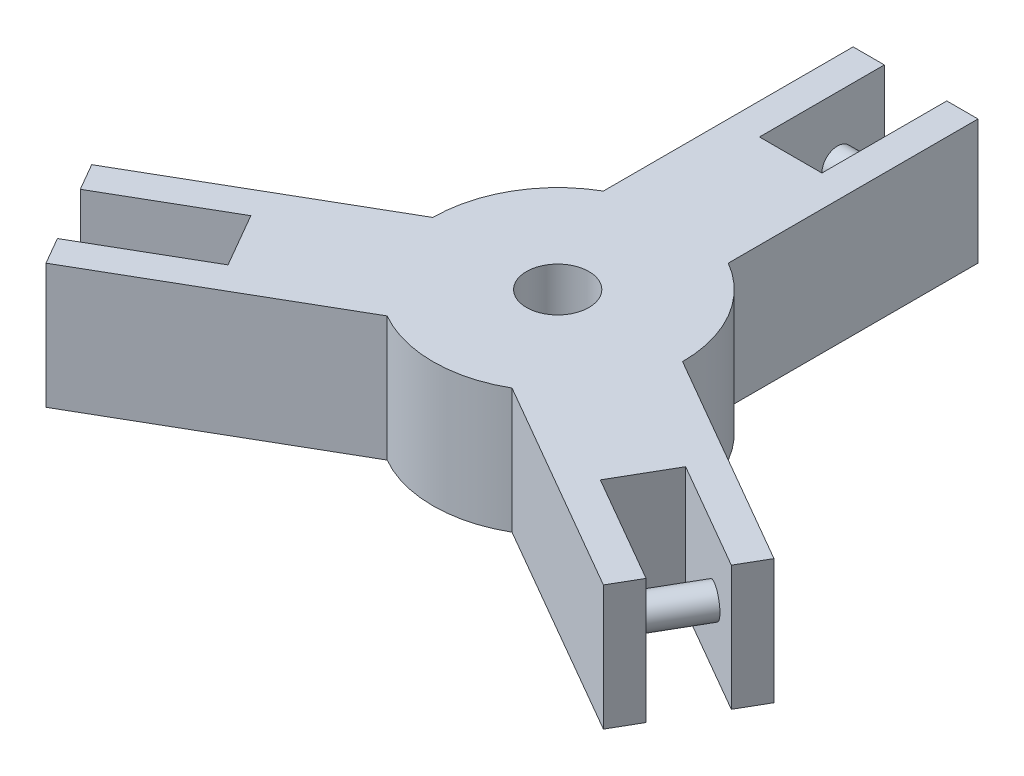
ISO-10303-21;
HEADER;
FILE_DESCRIPTION(('STEP AP214'),'2;1');
FILE_NAME('part.step','',(''),(''),'','','');
FILE_SCHEMA(('AUTOMOTIVE_DESIGN { 1 0 10303 214 1 1 1 1 }'));
ENDSEC;
DATA;
#1=APPLICATION_CONTEXT('core data for automotive mechanical design processes');
#2=APPLICATION_PROTOCOL_DEFINITION('international standard','automotive_design',2000,#1);
#3=PRODUCT_CONTEXT('',#1,'mechanical');
#4=PRODUCT('Part','Part','',(#3));
#5=PRODUCT_RELATED_PRODUCT_CATEGORY('part','',(#4));
#6=PRODUCT_DEFINITION_FORMATION('','',#4);
#7=PRODUCT_DEFINITION_CONTEXT('part definition',#1,'design');
#8=PRODUCT_DEFINITION('design','',#6,#7);
#9=PRODUCT_DEFINITION_SHAPE('','',#8);
#10=(LENGTH_UNIT() NAMED_UNIT(*) SI_UNIT(.MILLI.,.METRE.));
#11=(NAMED_UNIT(*) PLANE_ANGLE_UNIT() SI_UNIT($,.RADIAN.));
#12=(NAMED_UNIT(*) SI_UNIT($,.STERADIAN.) SOLID_ANGLE_UNIT());
#13=UNCERTAINTY_MEASURE_WITH_UNIT(LENGTH_MEASURE(1.E-05),#10,'distance_accuracy_value','');
#14=(GEOMETRIC_REPRESENTATION_CONTEXT(3) GLOBAL_UNCERTAINTY_ASSIGNED_CONTEXT((#13)) GLOBAL_UNIT_ASSIGNED_CONTEXT((#10,
#11,#12)) REPRESENTATION_CONTEXT('',''));
#15=CARTESIAN_POINT('',(0.,0.,0.));
#16=DIRECTION('',(0.,0.,1.));
#17=DIRECTION('',(1.,0.,0.));
#18=AXIS2_PLACEMENT_3D('',#15,#16,#17);
#19=CARTESIAN_POINT('',(10.,40.,0.));
#20=DIRECTION('',(1.,0.,0.));
#21=DIRECTION('',(0.,0.,-1.));
#22=AXIS2_PLACEMENT_3D('',#19,#20,#21);
#23=PLANE('',#22);
#24=DIRECTION('',(0.,0.,1.));
#25=VECTOR('',#24,1.);
#26=CARTESIAN_POINT('',(10.,0.,0.));
#27=LINE('',#26,#25);
#28=CARTESIAN_POINT('',(10.,0.,-114.641016151378));
#29=VERTEX_POINT('',#28);
#30=CARTESIAN_POINT('',(10.,0.,-74.6410161513775));
#31=VERTEX_POINT('',#30);
#32=EDGE_CURVE('E273',#29,#31,#27,.T.);
#33=ORIENTED_EDGE('',*,*,#32,.T.);
#34=DIRECTION('',(0.,-1.,0.));
#35=VECTOR('',#34,1.);
#36=CARTESIAN_POINT('',(10.,40.,-74.6410161513775));
#37=LINE('',#36,#35);
#38=CARTESIAN_POINT('',(10.,40.,-74.6410161513775));
#39=VERTEX_POINT('',#38);
#40=EDGE_CURVE('E322',#39,#31,#37,.T.);
#41=ORIENTED_EDGE('',*,*,#40,.F.);
#42=DIRECTION('',(0.,0.,1.));
#43=VECTOR('',#42,1.);
#44=CARTESIAN_POINT('',(10.,40.,0.));
#45=LINE('',#44,#43);
#46=CARTESIAN_POINT('',(10.,40.,-114.641016151378));
#47=VERTEX_POINT('',#46);
#48=EDGE_CURVE('E387',#47,#39,#45,.T.);
#49=ORIENTED_EDGE('',*,*,#48,.F.);
#50=DIRECTION('',(0.,-1.,0.));
#51=VECTOR('',#50,1.);
#52=CARTESIAN_POINT('',(10.,40.,-114.641016151378));
#53=LINE('',#52,#51);
#54=EDGE_CURVE('E325',#47,#29,#53,.T.);
#55=ORIENTED_EDGE('',*,*,#54,.T.);
#56=EDGE_LOOP('',(#33,#41,#49,#55));
#57=FACE_BOUND('',#56,.T.);
#58=CARTESIAN_POINT('',(10.,20.,-99.6410161513775));
#59=DIRECTION('',(1.,0.,0.));
#60=DIRECTION('',(0.,0.,-1.));
#61=AXIS2_PLACEMENT_3D('',#58,#59,#60);
#62=CIRCLE('',#61,5.);
#63=CARTESIAN_POINT('',(10.,20.,-104.641016151378));
#64=VERTEX_POINT('',#63);
#65=EDGE_CURVE('E350',#64,#64,#62,.F.);
#66=ORIENTED_EDGE('',*,*,#65,.F.);
#67=EDGE_LOOP('',(#66));
#68=FACE_BOUND('',#67,.T.);
#69=ADVANCED_FACE('F38',(#57,#68),#23,.F.);
#70=CARTESIAN_POINT('',(-9.99999999999999,40.,0.));
#71=DIRECTION('',(1.,0.,0.));
#72=DIRECTION('',(0.,0.,-1.));
#73=AXIS2_PLACEMENT_3D('',#70,#71,#72);
#74=PLANE('',#73);
#75=DIRECTION('',(0.,0.,1.));
#76=VECTOR('',#75,1.);
#77=CARTESIAN_POINT('',(-9.99999999999999,0.,0.));
#78=LINE('',#77,#76);
#79=CARTESIAN_POINT('',(-10.,0.,-114.641016151378));
#80=VERTEX_POINT('',#79);
#81=CARTESIAN_POINT('',(-10.,0.,-74.6410161513775));
#82=VERTEX_POINT('',#81);
#83=EDGE_CURVE('E278',#80,#82,#78,.T.);
#84=ORIENTED_EDGE('',*,*,#83,.F.);
#85=DIRECTION('',(0.,-1.,0.));
#86=VECTOR('',#85,1.);
#87=CARTESIAN_POINT('',(-10.,40.,-114.641016151378));
#88=LINE('',#87,#86);
#89=CARTESIAN_POINT('',(-10.,40.,-114.641016151378));
#90=VERTEX_POINT('',#89);
#91=EDGE_CURVE('E318',#90,#80,#88,.T.);
#92=ORIENTED_EDGE('',*,*,#91,.F.);
#93=DIRECTION('',(0.,0.,1.));
#94=VECTOR('',#93,1.);
#95=CARTESIAN_POINT('',(-9.99999999999999,40.,0.));
#96=LINE('',#95,#94);
#97=CARTESIAN_POINT('',(-10.,40.,-74.6410161513775));
#98=VERTEX_POINT('',#97);
#99=EDGE_CURVE('E391',#90,#98,#96,.T.);
#100=ORIENTED_EDGE('',*,*,#99,.T.);
#101=DIRECTION('',(0.,-1.,0.));
#102=VECTOR('',#101,1.);
#103=CARTESIAN_POINT('',(-10.,40.,-74.6410161513775));
#104=LINE('',#103,#102);
#105=EDGE_CURVE('E320',#98,#82,#104,.T.);
#106=ORIENTED_EDGE('',*,*,#105,.T.);
#107=EDGE_LOOP('',(#84,#92,#100,#106));
#108=FACE_BOUND('',#107,.T.);
#109=CARTESIAN_POINT('',(-10.,20.,-99.6410161513775));
#110=DIRECTION('',(1.,0.,0.));
#111=DIRECTION('',(0.,0.,-1.));
#112=AXIS2_PLACEMENT_3D('',#109,#110,#111);
#113=CIRCLE('',#112,5.);
#114=CARTESIAN_POINT('',(-10.,20.,-104.641016151378));
#115=VERTEX_POINT('',#114);
#116=EDGE_CURVE('E243',#115,#115,#113,.T.);
#117=ORIENTED_EDGE('',*,*,#116,.F.);
#118=EDGE_LOOP('',(#117));
#119=FACE_BOUND('',#118,.T.);
#120=ADVANCED_FACE('F432',(#108,#119),#74,.T.);
#121=CARTESIAN_POINT('',(10.0000000000007,40.,17.32050807569));
#122=DIRECTION('',(-0.5,0.,-0.866025403784438));
#123=DIRECTION('',(-0.866025403784438,0.,0.5));
#124=AXIS2_PLACEMENT_3D('',#121,#122,#123);
#125=PLANE('',#124);
#126=DIRECTION('',(0.866025403784438,0.,-0.5));
#127=VECTOR('',#126,1.);
#128=CARTESIAN_POINT('',(10.0000000000007,0.,17.32050807569));
#129=LINE('',#128,#127);
#130=CARTESIAN_POINT('',(-89.2820323027521,0.,74.6410161513776));
#131=VERTEX_POINT('',#130);
#132=CARTESIAN_POINT('',(-19.9999999999974,0.,34.6410161513782));
#133=VERTEX_POINT('',#132);
#134=EDGE_CURVE('E240',#131,#133,#129,.T.);
#135=ORIENTED_EDGE('',*,*,#134,.T.);
#136=DIRECTION('',(0.,-1.,0.));
#137=VECTOR('',#136,1.);
#138=CARTESIAN_POINT('',(-19.9999999999974,40.,34.6410161513782));
#139=LINE('',#138,#137);
#140=CARTESIAN_POINT('',(-19.9999999999974,40.,34.6410161513782));
#141=VERTEX_POINT('',#140);
#142=EDGE_CURVE('E42',#141,#133,#139,.T.);
#143=ORIENTED_EDGE('',*,*,#142,.F.);
#144=DIRECTION('',(0.866025403784438,0.,-0.5));
#145=VECTOR('',#144,1.);
#146=CARTESIAN_POINT('',(10.0000000000007,40.,17.32050807569));
#147=LINE('',#146,#145);
#148=CARTESIAN_POINT('',(-89.2820323027521,40.,74.6410161513776));
#149=VERTEX_POINT('',#148);
#150=EDGE_CURVE('E303',#149,#141,#147,.T.);
#151=ORIENTED_EDGE('',*,*,#150,.F.);
#152=DIRECTION('',(0.,-1.,0.));
#153=VECTOR('',#152,1.);
#154=CARTESIAN_POINT('',(-89.2820323027521,40.,74.6410161513776));
#155=LINE('',#154,#153);
#156=EDGE_CURVE('E57',#149,#131,#155,.T.);
#157=ORIENTED_EDGE('',*,*,#156,.T.);
#158=EDGE_LOOP('',(#135,#143,#151,#157));
#159=FACE_BOUND('',#158,.T.);
#160=ADVANCED_FACE('F40',(#159),#125,.F.);
#161=CARTESIAN_POINT('',(0.,40.,0.));
#162=DIRECTION('',(0.,-1.,0.));
#163=DIRECTION('',(0.,0.,-1.));
#164=AXIS2_PLACEMENT_3D('',#161,#162,#163);
#165=CYLINDRICAL_SURFACE('',#164,40.);
#166=CARTESIAN_POINT('',(0.,0.,0.));
#167=DIRECTION('',(0.,1.,0.));
#168=DIRECTION('',(0.,0.,1.));
#169=AXIS2_PLACEMENT_3D('',#166,#167,#168);
#170=CIRCLE('',#169,40.);
#171=CARTESIAN_POINT('',(20.0000000000018,0.,34.6410161513756));
#172=VERTEX_POINT('',#171);
#173=EDGE_CURVE('E242',#133,#172,#170,.T.);
#174=ORIENTED_EDGE('',*,*,#173,.T.);
#175=DIRECTION('',(0.,-1.,0.));
#176=VECTOR('',#175,1.);
#177=CARTESIAN_POINT('',(20.0000000000018,40.,34.6410161513756));
#178=LINE('',#177,#176);
#179=CARTESIAN_POINT('',(20.0000000000018,40.,34.6410161513756));
#180=VERTEX_POINT('',#179);
#181=EDGE_CURVE('E346',#180,#172,#178,.T.);
#182=ORIENTED_EDGE('',*,*,#181,.F.);
#183=CARTESIAN_POINT('',(0.,40.,0.));
#184=DIRECTION('',(0.,1.,0.));
#185=DIRECTION('',(0.,0.,1.));
#186=AXIS2_PLACEMENT_3D('',#183,#184,#185);
#187=CIRCLE('',#186,40.);
#188=EDGE_CURVE('E144',#141,#180,#187,.T.);
#189=ORIENTED_EDGE('',*,*,#188,.F.);
#190=ORIENTED_EDGE('',*,*,#142,.T.);
#191=EDGE_LOOP('',(#174,#182,#189,#190));
#192=FACE_BOUND('',#191,.T.);
#193=ADVANCED_FACE('F478',(#192),#165,.T.);
#194=CARTESIAN_POINT('',(-9.99999999999854,40.,17.3205080756863));
#195=DIRECTION('',(-0.5,0.,0.866025403784439));
#196=DIRECTION('',(0.866025403784439,0.,0.5));
#197=AXIS2_PLACEMENT_3D('',#194,#195,#196);
#198=PLANE('',#197);
#199=DIRECTION('',(-0.866025403784439,0.,-0.5));
#200=VECTOR('',#199,1.);
#201=CARTESIAN_POINT('',(-9.99999999999854,0.,17.3205080756863));
#202=LINE('',#201,#200);
#203=CARTESIAN_POINT('',(89.2820323027566,0.,74.641016151375));
#204=VERTEX_POINT('',#203);
#205=EDGE_CURVE('E246',#204,#172,#202,.T.);
#206=ORIENTED_EDGE('',*,*,#205,.F.);
#207=DIRECTION('',(0.,-1.,0.));
#208=VECTOR('',#207,1.);
#209=CARTESIAN_POINT('',(89.2820323027566,40.,74.641016151375));
#210=LINE('',#209,#208);
#211=CARTESIAN_POINT('',(89.2820323027566,40.,74.641016151375));
#212=VERTEX_POINT('',#211);
#213=EDGE_CURVE('E345',#212,#204,#210,.T.);
#214=ORIENTED_EDGE('',*,*,#213,.F.);
#215=DIRECTION('',(-0.866025403784439,0.,-0.5));
#216=VECTOR('',#215,1.);
#217=CARTESIAN_POINT('',(-9.99999999999854,40.,17.3205080756863));
#218=LINE('',#217,#216);
#219=EDGE_CURVE('E362',#212,#180,#218,.T.);
#220=ORIENTED_EDGE('',*,*,#219,.T.);
#221=ORIENTED_EDGE('',*,*,#181,.T.);
#222=EDGE_LOOP('',(#206,#214,#220,#221));
#223=FACE_BOUND('',#222,.T.);
#224=ADVANCED_FACE('F475',(#223),#198,.T.);
#225=CARTESIAN_POINT('',(99.2820323027551,40.,57.3205080756887));
#226=DIRECTION('',(0.866025403784439,0.,0.499999999999999));
#227=DIRECTION('',(0.499999999999999,0.,-0.866025403784439));
#228=AXIS2_PLACEMENT_3D('',#225,#226,#227);
#229=PLANE('',#228);
#230=DIRECTION('',(-0.499999999999999,0.,0.866025403784439));
#231=VECTOR('',#230,1.);
#232=CARTESIAN_POINT('',(99.2820323027551,0.,57.3205080756887));
#233=LINE('',#232,#231);
#234=CARTESIAN_POINT('',(94.2820323027566,0.,65.9807621135306));
#235=VERTEX_POINT('',#234);
#236=EDGE_CURVE('E251',#235,#204,#233,.T.);
#237=ORIENTED_EDGE('',*,*,#236,.F.);
#238=DIRECTION('',(0.,-1.,0.));
#239=VECTOR('',#238,1.);
#240=CARTESIAN_POINT('',(94.2820323027566,40.,65.9807621135306));
#241=LINE('',#240,#239);
#242=CARTESIAN_POINT('',(94.2820323027566,40.,65.9807621135306));
#243=VERTEX_POINT('',#242);
#244=EDGE_CURVE('E343',#243,#235,#241,.T.);
#245=ORIENTED_EDGE('',*,*,#244,.F.);
#246=DIRECTION('',(-0.499999999999999,0.,0.866025403784439));
#247=VECTOR('',#246,1.);
#248=CARTESIAN_POINT('',(99.2820323027551,40.,57.3205080756887));
#249=LINE('',#248,#247);
#250=EDGE_CURVE('E366',#243,#212,#249,.T.);
#251=ORIENTED_EDGE('',*,*,#250,.T.);
#252=ORIENTED_EDGE('',*,*,#213,.T.);
#253=EDGE_LOOP('',(#237,#245,#251,#252));
#254=FACE_BOUND('',#253,.T.);
#255=ADVANCED_FACE('F472',(#254),#229,.T.);
#256=CARTESIAN_POINT('',(-4.99999999999853,40.,8.66025403784185));
#257=DIRECTION('',(-0.5,0.,0.866025403784439));
#258=DIRECTION('',(0.866025403784439,0.,0.5));
#259=AXIS2_PLACEMENT_3D('',#256,#257,#258);
#260=PLANE('',#259);
#261=CARTESIAN_POINT('',(81.29165124599,20.,58.4807621135307));
#262=DIRECTION('',(-0.5,0.,0.866025403784439));
#263=DIRECTION('',(0.866025403784439,0.,0.5));
#264=AXIS2_PLACEMENT_3D('',#261,#262,#263);
#265=CIRCLE('',#264,5.);
#266=CARTESIAN_POINT('',(85.6217782649122,20.,60.9807621135307));
#267=VERTEX_POINT('',#266);
#268=EDGE_CURVE('E11',#267,#267,#265,.F.);
#269=ORIENTED_EDGE('',*,*,#268,.F.);
#270=EDGE_LOOP('',(#269));
#271=FACE_BOUND('',#270,.T.);
#272=DIRECTION('',(-0.866025403784439,0.,-0.5));
#273=VECTOR('',#272,1.);
#274=CARTESIAN_POINT('',(-4.99999999999853,0.,8.66025403784185));
#275=LINE('',#274,#273);
#276=CARTESIAN_POINT('',(59.641016151379,0.,45.9807621135306));
#277=VERTEX_POINT('',#276);
#278=EDGE_CURVE('E254',#235,#277,#275,.T.);
#279=ORIENTED_EDGE('',*,*,#278,.T.);
#280=DIRECTION('',(0.,-1.,0.));
#281=VECTOR('',#280,1.);
#282=CARTESIAN_POINT('',(59.641016151379,40.,45.9807621135306));
#283=LINE('',#282,#281);
#284=CARTESIAN_POINT('',(59.641016151379,40.,45.9807621135306));
#285=VERTEX_POINT('',#284);
#286=EDGE_CURVE('E340',#285,#277,#283,.T.);
#287=ORIENTED_EDGE('',*,*,#286,.F.);
#288=DIRECTION('',(-0.866025403784439,0.,-0.5));
#289=VECTOR('',#288,1.);
#290=CARTESIAN_POINT('',(-4.99999999999853,40.,8.66025403784185));
#291=LINE('',#290,#289);
#292=EDGE_CURVE('E369',#243,#285,#291,.T.);
#293=ORIENTED_EDGE('',*,*,#292,.F.);
#294=ORIENTED_EDGE('',*,*,#244,.T.);
#295=EDGE_LOOP('',(#279,#287,#293,#294));
#296=FACE_BOUND('',#295,.T.);
#297=ADVANCED_FACE('F468',(#271,#296),#260,.F.);
#298=CARTESIAN_POINT('',(64.6410161513776,40.,37.3205080756888));
#299=DIRECTION('',(-0.866025403784439,0.,-0.5));
#300=DIRECTION('',(-0.5,0.,0.866025403784439));
#301=AXIS2_PLACEMENT_3D('',#298,#299,#300);
#302=PLANE('',#301);
#303=DIRECTION('',(0.5,0.,-0.866025403784439));
#304=VECTOR('',#303,1.);
#305=CARTESIAN_POINT('',(64.6410161513776,0.,37.3205080756888));
#306=LINE('',#305,#304);
#307=CARTESIAN_POINT('',(69.641016151379,0.,28.6602540378418));
#308=VERTEX_POINT('',#307);
#309=EDGE_CURVE('E256',#277,#308,#306,.T.);
#310=ORIENTED_EDGE('',*,*,#309,.T.);
#311=DIRECTION('',(0.,-1.,0.));
#312=VECTOR('',#311,1.);
#313=CARTESIAN_POINT('',(69.641016151379,40.,28.6602540378418));
#314=LINE('',#313,#312);
#315=CARTESIAN_POINT('',(69.641016151379,40.,28.6602540378418));
#316=VERTEX_POINT('',#315);
#317=EDGE_CURVE('E338',#316,#308,#314,.T.);
#318=ORIENTED_EDGE('',*,*,#317,.F.);
#319=DIRECTION('',(0.5,0.,-0.866025403784439));
#320=VECTOR('',#319,1.);
#321=CARTESIAN_POINT('',(64.6410161513776,40.,37.3205080756888));
#322=LINE('',#321,#320);
#323=EDGE_CURVE('E371',#285,#316,#322,.T.);
#324=ORIENTED_EDGE('',*,*,#323,.F.);
#325=ORIENTED_EDGE('',*,*,#286,.T.);
#326=EDGE_LOOP('',(#310,#318,#324,#325));
#327=FACE_BOUND('',#326,.T.);
#328=ADVANCED_FACE('F464',(#327),#302,.F.);
#329=CARTESIAN_POINT('',(5.00000000000145,40.,-8.66025403784691));
#330=DIRECTION('',(-0.5,0.,0.866025403784439));
#331=DIRECTION('',(0.866025403784439,0.,0.5));
#332=AXIS2_PLACEMENT_3D('',#329,#330,#331);
#333=PLANE('',#332);
#334=CARTESIAN_POINT('',(91.2916512459889,20.,41.1602540378435));
#335=DIRECTION('',(-0.499999999999992,0.,0.866025403784443));
#336=DIRECTION('',(0.866025403784443,0.,0.499999999999992));
#337=AXIS2_PLACEMENT_3D('',#334,#335,#336);
#338=CIRCLE('',#337,5.);
#339=CARTESIAN_POINT('',(95.6217782649111,20.,43.6602540378435));
#340=VERTEX_POINT('',#339);
#341=EDGE_CURVE('E524',#340,#340,#338,.T.);
#342=ORIENTED_EDGE('',*,*,#341,.F.);
#343=EDGE_LOOP('',(#342));
#344=FACE_BOUND('',#343,.T.);
#345=DIRECTION('',(-0.866025403784439,0.,-0.5));
#346=VECTOR('',#345,1.);
#347=CARTESIAN_POINT('',(5.00000000000145,0.,-8.66025403784691));
#348=LINE('',#347,#346);
#349=CARTESIAN_POINT('',(104.282032302757,0.,48.6602540378418));
#350=VERTEX_POINT('',#349);
#351=EDGE_CURVE('E259',#350,#308,#348,.T.);
#352=ORIENTED_EDGE('',*,*,#351,.F.);
#353=DIRECTION('',(0.,-1.,0.));
#354=VECTOR('',#353,1.);
#355=CARTESIAN_POINT('',(104.282032302757,40.,48.6602540378418));
#356=LINE('',#355,#354);
#357=CARTESIAN_POINT('',(104.282032302757,40.,48.6602540378418));
#358=VERTEX_POINT('',#357);
#359=EDGE_CURVE('E336',#358,#350,#356,.T.);
#360=ORIENTED_EDGE('',*,*,#359,.F.);
#361=DIRECTION('',(-0.866025403784439,0.,-0.5));
#362=VECTOR('',#361,1.);
#363=CARTESIAN_POINT('',(5.00000000000145,40.,-8.66025403784691));
#364=LINE('',#363,#362);
#365=EDGE_CURVE('E373',#358,#316,#364,.T.);
#366=ORIENTED_EDGE('',*,*,#365,.T.);
#367=ORIENTED_EDGE('',*,*,#317,.T.);
#368=EDGE_LOOP('',(#352,#360,#366,#367));
#369=FACE_BOUND('',#368,.T.);
#370=ADVANCED_FACE('F460',(#344,#369),#333,.T.);
#371=CARTESIAN_POINT('',(99.2820323027552,40.,57.3205080756887));
#372=DIRECTION('',(0.866025403784439,0.,0.499999999999999));
#373=DIRECTION('',(0.499999999999999,0.,-0.866025403784439));
#374=AXIS2_PLACEMENT_3D('',#371,#372,#373);
#375=PLANE('',#374);
#376=DIRECTION('',(-0.499999999999999,0.,0.866025403784439));
#377=VECTOR('',#376,1.);
#378=CARTESIAN_POINT('',(99.2820323027552,0.,57.3205080756887));
#379=LINE('',#378,#377);
#380=CARTESIAN_POINT('',(109.282032302757,0.,39.9999999999975));
#381=VERTEX_POINT('',#380);
#382=EDGE_CURVE('E262',#381,#350,#379,.T.);
#383=ORIENTED_EDGE('',*,*,#382,.F.);
#384=DIRECTION('',(0.,-1.,0.));
#385=VECTOR('',#384,1.);
#386=CARTESIAN_POINT('',(109.282032302757,40.,39.9999999999975));
#387=LINE('',#386,#385);
#388=CARTESIAN_POINT('',(109.282032302757,40.,39.9999999999975));
#389=VERTEX_POINT('',#388);
#390=EDGE_CURVE('E334',#389,#381,#387,.T.);
#391=ORIENTED_EDGE('',*,*,#390,.F.);
#392=DIRECTION('',(-0.499999999999999,0.,0.866025403784439));
#393=VECTOR('',#392,1.);
#394=CARTESIAN_POINT('',(99.2820323027552,40.,57.3205080756887));
#395=LINE('',#394,#393);
#396=EDGE_CURVE('E376',#389,#358,#395,.T.);
#397=ORIENTED_EDGE('',*,*,#396,.T.);
#398=ORIENTED_EDGE('',*,*,#359,.T.);
#399=EDGE_LOOP('',(#383,#391,#397,#398));
#400=FACE_BOUND('',#399,.T.);
#401=ADVANCED_FACE('F456',(#400),#375,.T.);
#402=CARTESIAN_POINT('',(10.0000000000014,40.,-17.3205080756913));
#403=DIRECTION('',(-0.5,0.,0.866025403784439));
#404=DIRECTION('',(0.866025403784439,0.,0.5));
#405=AXIS2_PLACEMENT_3D('',#402,#403,#404);
#406=PLANE('',#405);
#407=DIRECTION('',(-0.866025403784439,0.,-0.5));
#408=VECTOR('',#407,1.);
#409=CARTESIAN_POINT('',(10.0000000000014,0.,-17.3205080756913));
#410=LINE('',#409,#408);
#411=CARTESIAN_POINT('',(40.0000000000007,0.,-2.51881848711828E-12));
#412=VERTEX_POINT('',#411);
#413=EDGE_CURVE('E265',#381,#412,#410,.T.);
#414=ORIENTED_EDGE('',*,*,#413,.T.);
#415=DIRECTION('',(0.,-1.,0.));
#416=VECTOR('',#415,1.);
#417=CARTESIAN_POINT('',(40.0000000000007,40.,-2.51881848711828E-12));
#418=LINE('',#417,#416);
#419=CARTESIAN_POINT('',(40.0000000000007,40.,-2.51881848711828E-12));
#420=VERTEX_POINT('',#419);
#421=EDGE_CURVE('E331',#420,#412,#418,.T.);
#422=ORIENTED_EDGE('',*,*,#421,.F.);
#423=DIRECTION('',(-0.866025403784439,0.,-0.5));
#424=VECTOR('',#423,1.);
#425=CARTESIAN_POINT('',(10.0000000000014,40.,-17.3205080756913));
#426=LINE('',#425,#424);
#427=EDGE_CURVE('E379',#389,#420,#426,.T.);
#428=ORIENTED_EDGE('',*,*,#427,.F.);
#429=ORIENTED_EDGE('',*,*,#390,.T.);
#430=EDGE_LOOP('',(#414,#422,#428,#429));
#431=FACE_BOUND('',#430,.T.);
#432=ADVANCED_FACE('F453',(#431),#406,.F.);
#433=CARTESIAN_POINT('',(20.,0.,-34.6410161513775));
#434=VERTEX_POINT('',#433);
#435=EDGE_CURVE('E248',#412,#434,#170,.T.);
#436=ORIENTED_EDGE('',*,*,#435,.T.);
#437=DIRECTION('',(0.,-1.,0.));
#438=VECTOR('',#437,1.);
#439=CARTESIAN_POINT('',(20.,40.,-34.6410161513775));
#440=LINE('',#439,#438);
#441=CARTESIAN_POINT('',(20.,40.,-34.6410161513775));
#442=VERTEX_POINT('',#441);
#443=EDGE_CURVE('E329',#442,#434,#440,.T.);
#444=ORIENTED_EDGE('',*,*,#443,.F.);
#445=EDGE_CURVE('E364',#420,#442,#187,.T.);
#446=ORIENTED_EDGE('',*,*,#445,.F.);
#447=ORIENTED_EDGE('',*,*,#421,.T.);
#448=EDGE_LOOP('',(#436,#444,#446,#447));
#449=FACE_BOUND('',#448,.T.);
#450=ADVANCED_FACE('F451',(#449),#165,.T.);
#451=CARTESIAN_POINT('',(20.,40.,0.));
#452=DIRECTION('',(1.,0.,0.));
#453=DIRECTION('',(0.,0.,-1.));
#454=AXIS2_PLACEMENT_3D('',#451,#452,#453);
#455=PLANE('',#454);
#456=DIRECTION('',(0.,0.,1.));
#457=VECTOR('',#456,1.);
#458=CARTESIAN_POINT('',(20.,0.,0.));
#459=LINE('',#458,#457);
#460=CARTESIAN_POINT('',(20.,0.,-114.641016151378));
#461=VERTEX_POINT('',#460);
#462=EDGE_CURVE('E267',#461,#434,#459,.T.);
#463=ORIENTED_EDGE('',*,*,#462,.F.);
#464=DIRECTION('',(0.,-1.,0.));
#465=VECTOR('',#464,1.);
#466=CARTESIAN_POINT('',(20.,40.,-114.641016151378));
#467=LINE('',#466,#465);
#468=CARTESIAN_POINT('',(20.,40.,-114.641016151378));
#469=VERTEX_POINT('',#468);
#470=EDGE_CURVE('E327',#469,#461,#467,.T.);
#471=ORIENTED_EDGE('',*,*,#470,.F.);
#472=DIRECTION('',(0.,0.,1.));
#473=VECTOR('',#472,1.);
#474=CARTESIAN_POINT('',(20.,40.,0.));
#475=LINE('',#474,#473);
#476=EDGE_CURVE('E381',#469,#442,#475,.T.);
#477=ORIENTED_EDGE('',*,*,#476,.T.);
#478=ORIENTED_EDGE('',*,*,#443,.T.);
#479=EDGE_LOOP('',(#463,#471,#477,#478));
#480=FACE_BOUND('',#479,.T.);
#481=ADVANCED_FACE('F447',(#480),#455,.T.);
#482=CARTESIAN_POINT('',(0.,40.,-114.641016151378));
#483=DIRECTION('',(0.,0.,-1.));
#484=DIRECTION('',(-1.,0.,0.));
#485=AXIS2_PLACEMENT_3D('',#482,#483,#484);
#486=PLANE('',#485);
#487=DIRECTION('',(1.,0.,0.));
#488=VECTOR('',#487,1.);
#489=CARTESIAN_POINT('',(0.,0.,-114.641016151378));
#490=LINE('',#489,#488);
#491=EDGE_CURVE('E270',#29,#461,#490,.T.);
#492=ORIENTED_EDGE('',*,*,#491,.F.);
#493=ORIENTED_EDGE('',*,*,#54,.F.);
#494=DIRECTION('',(1.,0.,0.));
#495=VECTOR('',#494,1.);
#496=CARTESIAN_POINT('',(0.,40.,-114.641016151378));
#497=LINE('',#496,#495);
#498=EDGE_CURVE('E384',#47,#469,#497,.T.);
#499=ORIENTED_EDGE('',*,*,#498,.T.);
#500=ORIENTED_EDGE('',*,*,#470,.T.);
#501=EDGE_LOOP('',(#492,#493,#499,#500));
#502=FACE_BOUND('',#501,.T.);
#503=ADVANCED_FACE('F444',(#502),#486,.T.);
#504=CARTESIAN_POINT('',(0.,40.,-74.6410161513775));
#505=DIRECTION('',(0.,0.,1.));
#506=DIRECTION('',(1.,0.,0.));
#507=AXIS2_PLACEMENT_3D('',#504,#505,#506);
#508=PLANE('',#507);
#509=DIRECTION('',(-1.,0.,0.));
#510=VECTOR('',#509,1.);
#511=CARTESIAN_POINT('',(0.,0.,-74.6410161513775));
#512=LINE('',#511,#510);
#513=EDGE_CURVE('E275',#31,#82,#512,.T.);
#514=ORIENTED_EDGE('',*,*,#513,.T.);
#515=ORIENTED_EDGE('',*,*,#105,.F.);
#516=DIRECTION('',(-1.,0.,0.));
#517=VECTOR('',#516,1.);
#518=CARTESIAN_POINT('',(0.,40.,-74.6410161513775));
#519=LINE('',#518,#517);
#520=EDGE_CURVE('E389',#39,#98,#519,.T.);
#521=ORIENTED_EDGE('',*,*,#520,.F.);
#522=ORIENTED_EDGE('',*,*,#40,.T.);
#523=EDGE_LOOP('',(#514,#515,#521,#522));
#524=FACE_BOUND('',#523,.T.);
#525=ADVANCED_FACE('F443',(#524),#508,.F.);
#526=CARTESIAN_POINT('',(0.,40.,-114.641016151378));
#527=DIRECTION('',(0.,0.,-1.));
#528=DIRECTION('',(-1.,0.,0.));
#529=AXIS2_PLACEMENT_3D('',#526,#527,#528);
#530=PLANE('',#529);
#531=DIRECTION('',(1.,0.,0.));
#532=VECTOR('',#531,1.);
#533=CARTESIAN_POINT('',(0.,0.,-114.641016151378));
#534=LINE('',#533,#532);
#535=CARTESIAN_POINT('',(-20.,0.,-114.641016151378));
#536=VERTEX_POINT('',#535);
#537=EDGE_CURVE('E281',#536,#80,#534,.T.);
#538=ORIENTED_EDGE('',*,*,#537,.F.);
#539=DIRECTION('',(0.,-1.,0.));
#540=VECTOR('',#539,1.);
#541=CARTESIAN_POINT('',(-20.,40.,-114.641016151378));
#542=LINE('',#541,#540);
#543=CARTESIAN_POINT('',(-20.,40.,-114.641016151378));
#544=VERTEX_POINT('',#543);
#545=EDGE_CURVE('E316',#544,#536,#542,.T.);
#546=ORIENTED_EDGE('',*,*,#545,.F.);
#547=DIRECTION('',(1.,0.,0.));
#548=VECTOR('',#547,1.);
#549=CARTESIAN_POINT('',(0.,40.,-114.641016151378));
#550=LINE('',#549,#548);
#551=EDGE_CURVE('E394',#544,#90,#550,.T.);
#552=ORIENTED_EDGE('',*,*,#551,.T.);
#553=ORIENTED_EDGE('',*,*,#91,.T.);
#554=EDGE_LOOP('',(#538,#546,#552,#553));
#555=FACE_BOUND('',#554,.T.);
#556=ADVANCED_FACE('F559',(#555),#530,.T.);
#557=CARTESIAN_POINT('',(-20.,40.,0.));
#558=DIRECTION('',(1.,0.,0.));
#559=DIRECTION('',(0.,0.,-1.));
#560=AXIS2_PLACEMENT_3D('',#557,#558,#559);
#561=PLANE('',#560);
#562=DIRECTION('',(0.,0.,1.));
#563=VECTOR('',#562,1.);
#564=CARTESIAN_POINT('',(-20.,0.,0.));
#565=LINE('',#564,#563);
#566=CARTESIAN_POINT('',(-20.,0.,-34.6410161513776));
#567=VERTEX_POINT('',#566);
#568=EDGE_CURVE('E284',#536,#567,#565,.T.);
#569=ORIENTED_EDGE('',*,*,#568,.T.);
#570=DIRECTION('',(0.,-1.,0.));
#571=VECTOR('',#570,1.);
#572=CARTESIAN_POINT('',(-20.,40.,-34.6410161513776));
#573=LINE('',#572,#571);
#574=CARTESIAN_POINT('',(-20.,40.,-34.6410161513776));
#575=VERTEX_POINT('',#574);
#576=EDGE_CURVE('E313',#575,#567,#573,.T.);
#577=ORIENTED_EDGE('',*,*,#576,.F.);
#578=DIRECTION('',(0.,0.,1.));
#579=VECTOR('',#578,1.);
#580=CARTESIAN_POINT('',(-20.,40.,0.));
#581=LINE('',#580,#579);
#582=EDGE_CURVE('E397',#544,#575,#581,.T.);
#583=ORIENTED_EDGE('',*,*,#582,.F.);
#584=ORIENTED_EDGE('',*,*,#545,.T.);
#585=EDGE_LOOP('',(#569,#577,#583,#584));
#586=FACE_BOUND('',#585,.T.);
#587=ADVANCED_FACE('F564',(#586),#561,.F.);
#588=CARTESIAN_POINT('',(-39.9999999999985,0.,0.));
#589=VERTEX_POINT('',#588);
#590=EDGE_CURVE('E247',#567,#589,#170,.T.);
#591=ORIENTED_EDGE('',*,*,#590,.T.);
#592=DIRECTION('',(0.,-1.,0.));
#593=VECTOR('',#592,1.);
#594=CARTESIAN_POINT('',(-39.9999999999985,40.,0.));
#595=LINE('',#594,#593);
#596=CARTESIAN_POINT('',(-39.9999999999985,40.,0.));
#597=VERTEX_POINT('',#596);
#598=EDGE_CURVE('E311',#597,#589,#595,.T.);
#599=ORIENTED_EDGE('',*,*,#598,.F.);
#600=EDGE_CURVE('E363',#575,#597,#187,.T.);
#601=ORIENTED_EDGE('',*,*,#600,.F.);
#602=ORIENTED_EDGE('',*,*,#576,.T.);
#603=EDGE_LOOP('',(#591,#599,#601,#602));
#604=FACE_BOUND('',#603,.T.);
#605=ADVANCED_FACE('F483',(#604),#165,.T.);
#606=CARTESIAN_POINT('',(-9.99999999999928,40.,-17.3205080756875));
#607=DIRECTION('',(-0.500000000000001,0.,-0.866025403784438));
#608=DIRECTION('',(-0.866025403784438,0.,0.500000000000001));
#609=AXIS2_PLACEMENT_3D('',#606,#607,#608);
#610=PLANE('',#609);
#611=DIRECTION('',(0.866025403784438,0.,-0.500000000000001));
#612=VECTOR('',#611,1.);
#613=CARTESIAN_POINT('',(-9.99999999999928,0.,-17.3205080756875));
#614=LINE('',#613,#612);
#615=CARTESIAN_POINT('',(-109.282032302752,0.,40.0000000000001));
#616=VERTEX_POINT('',#615);
#617=EDGE_CURVE('E286',#616,#589,#614,.T.);
#618=ORIENTED_EDGE('',*,*,#617,.F.);
#619=DIRECTION('',(0.,-1.,0.));
#620=VECTOR('',#619,1.);
#621=CARTESIAN_POINT('',(-109.282032302752,40.,40.0000000000001));
#622=LINE('',#621,#620);
#623=CARTESIAN_POINT('',(-109.282032302752,40.,40.0000000000001));
#624=VERTEX_POINT('',#623);
#625=EDGE_CURVE('E309',#624,#616,#622,.T.);
#626=ORIENTED_EDGE('',*,*,#625,.F.);
#627=DIRECTION('',(0.866025403784438,0.,-0.500000000000001));
#628=VECTOR('',#627,1.);
#629=CARTESIAN_POINT('',(-9.99999999999928,40.,-17.3205080756875));
#630=LINE('',#629,#628);
#631=EDGE_CURVE('E399',#624,#597,#630,.T.);
#632=ORIENTED_EDGE('',*,*,#631,.T.);
#633=ORIENTED_EDGE('',*,*,#598,.T.);
#634=EDGE_LOOP('',(#618,#626,#632,#633));
#635=FACE_BOUND('',#634,.T.);
#636=ADVANCED_FACE('F412',(#635),#610,.T.);
#637=CARTESIAN_POINT('',(-99.2820323027529,40.,57.3205080756876));
#638=DIRECTION('',(-0.866025403784438,0.,0.500000000000001));
#639=DIRECTION('',(0.500000000000001,0.,0.866025403784438));
#640=AXIS2_PLACEMENT_3D('',#637,#638,#639);
#641=PLANE('',#640);
#642=DIRECTION('',(-0.500000000000001,0.,-0.866025403784438));
#643=VECTOR('',#642,1.);
#644=CARTESIAN_POINT('',(-99.2820323027529,0.,57.3205080756876));
#645=LINE('',#644,#643);
#646=CARTESIAN_POINT('',(-104.282032302752,0.,48.6602540378445));
#647=VERTEX_POINT('',#646);
#648=EDGE_CURVE('E289',#647,#616,#645,.T.);
#649=ORIENTED_EDGE('',*,*,#648,.F.);
#650=DIRECTION('',(0.,-1.,0.));
#651=VECTOR('',#650,1.);
#652=CARTESIAN_POINT('',(-104.282032302752,40.,48.6602540378445));
#653=LINE('',#652,#651);
#654=CARTESIAN_POINT('',(-104.282032302752,40.,48.6602540378445));
#655=VERTEX_POINT('',#654);
#656=EDGE_CURVE('E307',#655,#647,#653,.T.);
#657=ORIENTED_EDGE('',*,*,#656,.F.);
#658=DIRECTION('',(-0.500000000000001,0.,-0.866025403784438));
#659=VECTOR('',#658,1.);
#660=CARTESIAN_POINT('',(-99.2820323027529,40.,57.3205080756876));
#661=LINE('',#660,#659);
#662=EDGE_CURVE('E402',#655,#624,#661,.T.);
#663=ORIENTED_EDGE('',*,*,#662,.T.);
#664=ORIENTED_EDGE('',*,*,#625,.T.);
#665=EDGE_LOOP('',(#649,#657,#663,#664));
#666=FACE_BOUND('',#665,.T.);
#667=ADVANCED_FACE('F406',(#666),#641,.T.);
#668=CARTESIAN_POINT('',(-4.99999999999926,40.,-8.66025403784309));
#669=DIRECTION('',(-0.5,0.,-0.866025403784438));
#670=DIRECTION('',(-0.866025403784438,0.,0.5));
#671=AXIS2_PLACEMENT_3D('',#668,#669,#670);
#672=PLANE('',#671);
#673=CARTESIAN_POINT('',(-91.2916512459878,20.,41.1602540378457));
#674=DIRECTION('',(-0.5,0.,-0.866025403784438));
#675=DIRECTION('',(-0.866025403784438,0.,0.5));
#676=AXIS2_PLACEMENT_3D('',#673,#674,#675);
#677=CIRCLE('',#676,5.);
#678=CARTESIAN_POINT('',(-95.62177826491,20.,43.6602540378457));
#679=VERTEX_POINT('',#678);
#680=EDGE_CURVE('E48',#679,#679,#677,.F.);
#681=ORIENTED_EDGE('',*,*,#680,.F.);
#682=EDGE_LOOP('',(#681));
#683=FACE_BOUND('',#682,.T.);
#684=DIRECTION('',(0.866025403784438,0.,-0.5));
#685=VECTOR('',#684,1.);
#686=CARTESIAN_POINT('',(-4.99999999999926,0.,-8.66025403784309));
#687=LINE('',#686,#685);
#688=CARTESIAN_POINT('',(-69.6410161513746,0.,28.6602540378444));
#689=VERTEX_POINT('',#688);
#690=EDGE_CURVE('E292',#647,#689,#687,.T.);
#691=ORIENTED_EDGE('',*,*,#690,.T.);
#692=DIRECTION('',(0.,-1.,0.));
#693=VECTOR('',#692,1.);
#694=CARTESIAN_POINT('',(-69.6410161513746,40.,28.6602540378444));
#695=LINE('',#694,#693);
#696=CARTESIAN_POINT('',(-69.6410161513746,40.,28.6602540378444));
#697=VERTEX_POINT('',#696);
#698=EDGE_CURVE('E229',#697,#689,#695,.T.);
#699=ORIENTED_EDGE('',*,*,#698,.F.);
#700=DIRECTION('',(0.866025403784438,0.,-0.5));
#701=VECTOR('',#700,1.);
#702=CARTESIAN_POINT('',(-4.99999999999926,40.,-8.66025403784309));
#703=LINE('',#702,#701);
#704=EDGE_CURVE('E217',#655,#697,#703,.T.);
#705=ORIENTED_EDGE('',*,*,#704,.F.);
#706=ORIENTED_EDGE('',*,*,#656,.T.);
#707=EDGE_LOOP('',(#691,#699,#705,#706));
#708=FACE_BOUND('',#707,.T.);
#709=ADVANCED_FACE('F420',(#683,#708),#672,.F.);
#710=CARTESIAN_POINT('',(-64.6410161513753,40.,37.3205080756875));
#711=DIRECTION('',(0.866025403784438,0.,-0.5));
#712=DIRECTION('',(-0.5,0.,-0.866025403784438));
#713=AXIS2_PLACEMENT_3D('',#710,#711,#712);
#714=PLANE('',#713);
#715=DIRECTION('',(0.5,0.,0.866025403784438));
#716=VECTOR('',#715,1.);
#717=CARTESIAN_POINT('',(-64.6410161513753,0.,37.3205080756875));
#718=LINE('',#717,#716);
#719=CARTESIAN_POINT('',(-59.6410161513746,0.,45.9807621135332));
#720=VERTEX_POINT('',#719);
#721=EDGE_CURVE('E226',#689,#720,#718,.T.);
#722=ORIENTED_EDGE('',*,*,#721,.T.);
#723=DIRECTION('',(0.,-1.,0.));
#724=VECTOR('',#723,1.);
#725=CARTESIAN_POINT('',(-59.6410161513746,40.,45.9807621135332));
#726=LINE('',#725,#724);
#727=CARTESIAN_POINT('',(-59.6410161513746,40.,45.9807621135332));
#728=VERTEX_POINT('',#727);
#729=EDGE_CURVE('E223',#728,#720,#726,.T.);
#730=ORIENTED_EDGE('',*,*,#729,.F.);
#731=DIRECTION('',(0.5,0.,0.866025403784438));
#732=VECTOR('',#731,1.);
#733=CARTESIAN_POINT('',(-64.6410161513753,40.,37.3205080756875));
#734=LINE('',#733,#732);
#735=EDGE_CURVE('E208',#697,#728,#734,.T.);
#736=ORIENTED_EDGE('',*,*,#735,.F.);
#737=ORIENTED_EDGE('',*,*,#698,.T.);
#738=EDGE_LOOP('',(#722,#730,#736,#737));
#739=FACE_BOUND('',#738,.T.);
#740=ADVANCED_FACE('F224',(#739),#714,.F.);
#741=CARTESIAN_POINT('',(5.00000000000075,40.,8.66025403784568));
#742=DIRECTION('',(-0.5,0.,-0.866025403784438));
#743=DIRECTION('',(-0.866025403784438,0.,0.5));
#744=AXIS2_PLACEMENT_3D('',#741,#742,#743);
#745=PLANE('',#744);
#746=CARTESIAN_POINT('',(-81.2916512459882,20.,58.4807621135335));
#747=DIRECTION('',(-0.500000000000004,0.,-0.866025403784436));
#748=DIRECTION('',(-0.866025403784436,0.,0.500000000000004));
#749=AXIS2_PLACEMENT_3D('',#746,#747,#748);
#750=CIRCLE('',#749,5.);
#751=CARTESIAN_POINT('',(-85.6217782649104,20.,60.9807621135336));
#752=VERTEX_POINT('',#751);
#753=EDGE_CURVE('E766',#752,#752,#750,.T.);
#754=ORIENTED_EDGE('',*,*,#753,.F.);
#755=EDGE_LOOP('',(#754));
#756=FACE_BOUND('',#755,.T.);
#757=DIRECTION('',(0.866025403784439,0.,-0.5));
#758=VECTOR('',#757,1.);
#759=CARTESIAN_POINT('',(5.00000000000075,0.,8.66025403784568));
#760=LINE('',#759,#758);
#761=CARTESIAN_POINT('',(-94.2820323027521,0.,65.9807621135332));
#762=VERTEX_POINT('',#761);
#763=EDGE_CURVE('E295',#762,#720,#760,.T.);
#764=ORIENTED_EDGE('',*,*,#763,.F.);
#765=DIRECTION('',(0.,-1.,0.));
#766=VECTOR('',#765,1.);
#767=CARTESIAN_POINT('',(-94.2820323027521,40.,65.9807621135332));
#768=LINE('',#767,#766);
#769=CARTESIAN_POINT('',(-94.2820323027521,40.,65.9807621135332));
#770=VERTEX_POINT('',#769);
#771=EDGE_CURVE('E131',#770,#762,#768,.T.);
#772=ORIENTED_EDGE('',*,*,#771,.F.);
#773=DIRECTION('',(0.866025403784439,0.,-0.5));
#774=VECTOR('',#773,1.);
#775=CARTESIAN_POINT('',(5.00000000000075,40.,8.66025403784568));
#776=LINE('',#775,#774);
#777=EDGE_CURVE('E214',#770,#728,#776,.T.);
#778=ORIENTED_EDGE('',*,*,#777,.T.);
#779=ORIENTED_EDGE('',*,*,#729,.T.);
#780=EDGE_LOOP('',(#764,#772,#778,#779));
#781=FACE_BOUND('',#780,.T.);
#782=ADVANCED_FACE('F231',(#756,#781),#745,.T.);
#783=CARTESIAN_POINT('',(-99.2820323027529,40.,57.3205080756875));
#784=DIRECTION('',(-0.866025403784438,0.,0.5));
#785=DIRECTION('',(0.5,0.,0.866025403784438));
#786=AXIS2_PLACEMENT_3D('',#783,#784,#785);
#787=PLANE('',#786);
#788=DIRECTION('',(-0.5,0.,-0.866025403784438));
#789=VECTOR('',#788,1.);
#790=CARTESIAN_POINT('',(-99.2820323027529,0.,57.3205080756875));
#791=LINE('',#790,#789);
#792=EDGE_CURVE('E297',#131,#762,#791,.T.);
#793=ORIENTED_EDGE('',*,*,#792,.F.);
#794=ORIENTED_EDGE('',*,*,#156,.F.);
#795=DIRECTION('',(-0.5,0.,-0.866025403784438));
#796=VECTOR('',#795,1.);
#797=CARTESIAN_POINT('',(-99.2820323027529,40.,57.3205080756875));
#798=LINE('',#797,#796);
#799=EDGE_CURVE('E232',#149,#770,#798,.T.);
#800=ORIENTED_EDGE('',*,*,#799,.T.);
#801=ORIENTED_EDGE('',*,*,#771,.T.);
#802=EDGE_LOOP('',(#793,#794,#800,#801));
#803=FACE_BOUND('',#802,.T.);
#804=ADVANCED_FACE('F491',(#803),#787,.T.);
#805=CARTESIAN_POINT('',(0.,40.,0.));
#806=DIRECTION('',(0.,-1.,0.));
#807=DIRECTION('',(0.,0.,-1.));
#808=AXIS2_PLACEMENT_3D('',#805,#806,#807);
#809=CYLINDRICAL_SURFACE('',#808,10.);
#810=CARTESIAN_POINT('',(0.,40.,0.));
#811=DIRECTION('',(0.,1.,0.));
#812=DIRECTION('',(0.,0.,1.));
#813=AXIS2_PLACEMENT_3D('',#810,#811,#812);
#814=CIRCLE('',#813,10.);
#815=CARTESIAN_POINT('',(0.,40.,10.));
#816=VERTEX_POINT('',#815);
#817=EDGE_CURVE('E234',#816,#816,#814,.T.);
#818=ORIENTED_EDGE('',*,*,#817,.T.);
#819=EDGE_LOOP('',(#818));
#820=FACE_BOUND('',#819,.T.);
#821=CARTESIAN_POINT('',(0.,0.,0.));
#822=DIRECTION('',(0.,1.,0.));
#823=DIRECTION('',(0.,0.,1.));
#824=AXIS2_PLACEMENT_3D('',#821,#822,#823);
#825=CIRCLE('',#824,10.);
#826=CARTESIAN_POINT('',(0.,0.,10.));
#827=VERTEX_POINT('',#826);
#828=EDGE_CURVE('E300',#827,#827,#825,.T.);
#829=ORIENTED_EDGE('',*,*,#828,.F.);
#830=EDGE_LOOP('',(#829));
#831=FACE_BOUND('',#830,.T.);
#832=ADVANCED_FACE('F493',(#820,#831),#809,.F.);
#833=CARTESIAN_POINT('',(0.,40.,0.));
#834=DIRECTION('',(0.,1.,0.));
#835=DIRECTION('',(0.,0.,1.));
#836=AXIS2_PLACEMENT_3D('',#833,#834,#835);
#837=PLANE('',#836);
#838=ORIENTED_EDGE('',*,*,#150,.T.);
#839=ORIENTED_EDGE('',*,*,#188,.T.);
#840=ORIENTED_EDGE('',*,*,#219,.F.);
#841=ORIENTED_EDGE('',*,*,#250,.F.);
#842=ORIENTED_EDGE('',*,*,#292,.T.);
#843=ORIENTED_EDGE('',*,*,#323,.T.);
#844=ORIENTED_EDGE('',*,*,#365,.F.);
#845=ORIENTED_EDGE('',*,*,#396,.F.);
#846=ORIENTED_EDGE('',*,*,#427,.T.);
#847=ORIENTED_EDGE('',*,*,#445,.T.);
#848=ORIENTED_EDGE('',*,*,#476,.F.);
#849=ORIENTED_EDGE('',*,*,#498,.F.);
#850=ORIENTED_EDGE('',*,*,#48,.T.);
#851=ORIENTED_EDGE('',*,*,#520,.T.);
#852=ORIENTED_EDGE('',*,*,#99,.F.);
#853=ORIENTED_EDGE('',*,*,#551,.F.);
#854=ORIENTED_EDGE('',*,*,#582,.T.);
#855=ORIENTED_EDGE('',*,*,#600,.T.);
#856=ORIENTED_EDGE('',*,*,#631,.F.);
#857=ORIENTED_EDGE('',*,*,#662,.F.);
#858=ORIENTED_EDGE('',*,*,#704,.T.);
#859=ORIENTED_EDGE('',*,*,#735,.T.);
#860=ORIENTED_EDGE('',*,*,#777,.F.);
#861=ORIENTED_EDGE('',*,*,#799,.F.);
#862=EDGE_LOOP('',(#838,#839,#840,#841,#842,#843,#844,#845,#846,#847,#848,#849,#850,#851,#852,
#853,#854,#855,#856,#857,#858,#859,#860,#861));
#863=FACE_BOUND('',#862,.T.);
#864=ORIENTED_EDGE('',*,*,#817,.F.);
#865=EDGE_LOOP('',(#864));
#866=FACE_BOUND('',#865,.T.);
#867=ADVANCED_FACE('F210',(#863,#866),#837,.T.);
#868=CARTESIAN_POINT('',(0.,0.,0.));
#869=DIRECTION('',(0.,1.,0.));
#870=DIRECTION('',(0.,0.,1.));
#871=AXIS2_PLACEMENT_3D('',#868,#869,#870);
#872=PLANE('',#871);
#873=ORIENTED_EDGE('',*,*,#134,.F.);
#874=ORIENTED_EDGE('',*,*,#792,.T.);
#875=ORIENTED_EDGE('',*,*,#763,.T.);
#876=ORIENTED_EDGE('',*,*,#721,.F.);
#877=ORIENTED_EDGE('',*,*,#690,.F.);
#878=ORIENTED_EDGE('',*,*,#648,.T.);
#879=ORIENTED_EDGE('',*,*,#617,.T.);
#880=ORIENTED_EDGE('',*,*,#590,.F.);
#881=ORIENTED_EDGE('',*,*,#568,.F.);
#882=ORIENTED_EDGE('',*,*,#537,.T.);
#883=ORIENTED_EDGE('',*,*,#83,.T.);
#884=ORIENTED_EDGE('',*,*,#513,.F.);
#885=ORIENTED_EDGE('',*,*,#32,.F.);
#886=ORIENTED_EDGE('',*,*,#491,.T.);
#887=ORIENTED_EDGE('',*,*,#462,.T.);
#888=ORIENTED_EDGE('',*,*,#435,.F.);
#889=ORIENTED_EDGE('',*,*,#413,.F.);
#890=ORIENTED_EDGE('',*,*,#382,.T.);
#891=ORIENTED_EDGE('',*,*,#351,.T.);
#892=ORIENTED_EDGE('',*,*,#309,.F.);
#893=ORIENTED_EDGE('',*,*,#278,.F.);
#894=ORIENTED_EDGE('',*,*,#236,.T.);
#895=ORIENTED_EDGE('',*,*,#205,.T.);
#896=ORIENTED_EDGE('',*,*,#173,.F.);
#897=EDGE_LOOP('',(#873,#874,#875,#876,#877,#878,#879,#880,#881,#882,#883,#884,#885,#886,#887,
#888,#889,#890,#891,#892,#893,#894,#895,#896));
#898=FACE_BOUND('',#897,.T.);
#899=ORIENTED_EDGE('',*,*,#828,.T.);
#900=EDGE_LOOP('',(#899));
#901=FACE_BOUND('',#900,.T.);
#902=ADVANCED_FACE('F417',(#898,#901),#872,.F.);
#903=CARTESIAN_POINT('',(15.,20.,-99.6410161513775));
#904=DIRECTION('',(-1.,0.,0.));
#905=DIRECTION('',(0.,0.,1.));
#906=AXIS2_PLACEMENT_3D('',#903,#904,#905);
#907=CYLINDRICAL_SURFACE('',#906,5.);
#908=ORIENTED_EDGE('',*,*,#116,.T.);
#909=EDGE_LOOP('',(#908));
#910=FACE_BOUND('',#909,.T.);
#911=ORIENTED_EDGE('',*,*,#65,.T.);
#912=EDGE_LOOP('',(#911));
#913=FACE_BOUND('',#912,.T.);
#914=ADVANCED_FACE('F506',(#910,#913),#907,.T.);
#915=CARTESIAN_POINT('',(-93.7916512459883,20.,36.8301270189226));
#916=DIRECTION('',(0.500000000000004,0.,0.866025403784436));
#917=DIRECTION('',(0.866025403784436,0.,-0.500000000000004));
#918=AXIS2_PLACEMENT_3D('',#915,#916,#917);
#919=CYLINDRICAL_SURFACE('',#918,5.);
#920=ORIENTED_EDGE('',*,*,#753,.T.);
#921=EDGE_LOOP('',(#920));
#922=FACE_BOUND('',#921,.T.);
#923=ORIENTED_EDGE('',*,*,#680,.T.);
#924=EDGE_LOOP('',(#923));
#925=FACE_BOUND('',#924,.T.);
#926=ADVANCED_FACE('F511',(#922,#925),#919,.T.);
#927=CARTESIAN_POINT('',(78.7916512459891,20.,62.8108891324546));
#928=DIRECTION('',(0.499999999999992,0.,-0.866025403784443));
#929=DIRECTION('',(-0.866025403784443,0.,-0.499999999999992));
#930=AXIS2_PLACEMENT_3D('',#927,#928,#929);
#931=CYLINDRICAL_SURFACE('',#930,5.);
#932=ORIENTED_EDGE('',*,*,#341,.T.);
#933=EDGE_LOOP('',(#932));
#934=FACE_BOUND('',#933,.T.);
#935=ORIENTED_EDGE('',*,*,#268,.T.);
#936=EDGE_LOOP('',(#935));
#937=FACE_BOUND('',#936,.T.);
#938=ADVANCED_FACE('F515',(#934,#937),#931,.T.);
#939=CLOSED_SHELL('',(#69,#120,#160,#193,#224,#255,#297,#328,#370,#401,#432,#450,#481,#503,#525,
#556,#587,#605,#636,#667,#709,#740,#782,#804,#832,#867,#902,#914,#926,#938));
#940=MANIFOLD_SOLID_BREP('B2',#939);
#941=ADVANCED_BREP_SHAPE_REPRESENTATION('',(#18,#940),#14);
#942=SHAPE_DEFINITION_REPRESENTATION(#9,#941);
ENDSEC;
END-ISO-10303-21;
